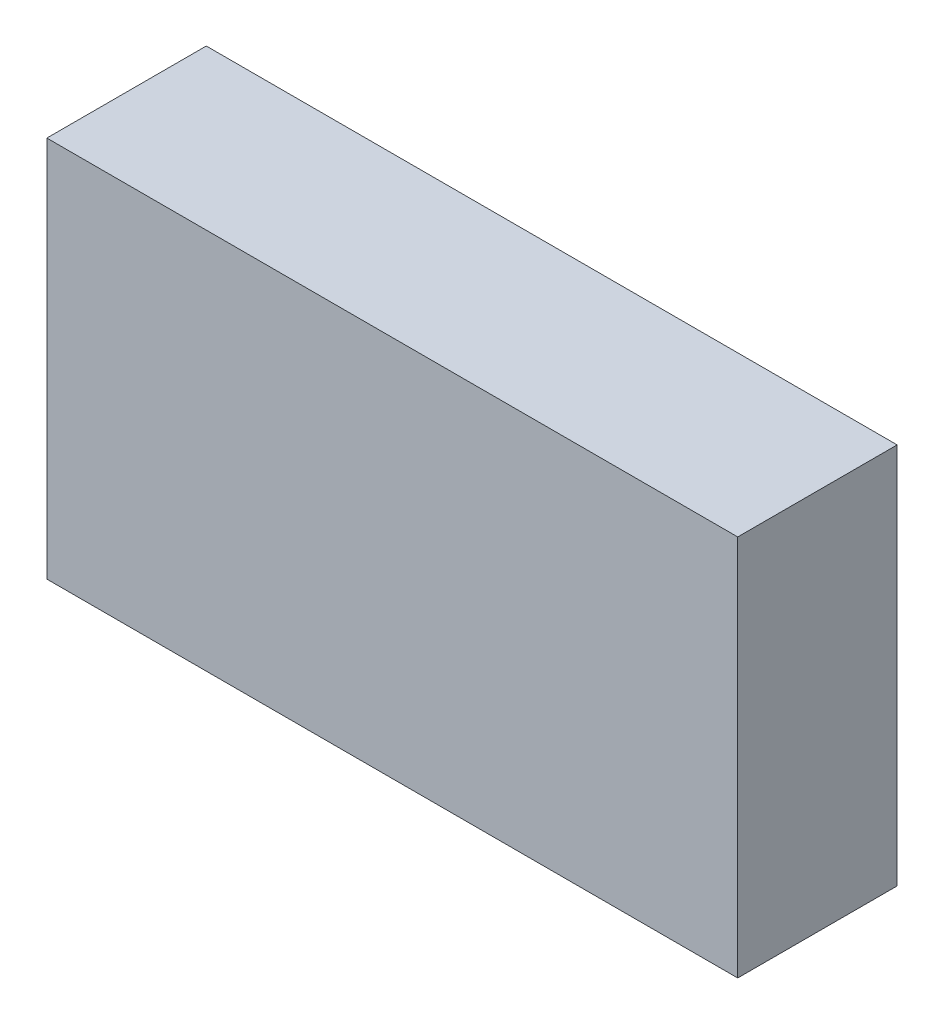
ISO-10303-21;
HEADER;
FILE_DESCRIPTION(('STEP AP214'),'2;1');
FILE_NAME('part.step','',(''),(''),'','','');
FILE_SCHEMA(('AUTOMOTIVE_DESIGN { 1 0 10303 214 1 1 1 1 }'));
ENDSEC;
DATA;
#1=APPLICATION_CONTEXT('core data for automotive mechanical design processes');
#2=APPLICATION_PROTOCOL_DEFINITION('international standard','automotive_design',2000,#1);
#3=PRODUCT_CONTEXT('',#1,'mechanical');
#4=PRODUCT('Part','Part','',(#3));
#5=PRODUCT_RELATED_PRODUCT_CATEGORY('part','',(#4));
#6=PRODUCT_DEFINITION_FORMATION('','',#4);
#7=PRODUCT_DEFINITION_CONTEXT('part definition',#1,'design');
#8=PRODUCT_DEFINITION('design','',#6,#7);
#9=PRODUCT_DEFINITION_SHAPE('','',#8);
#10=(LENGTH_UNIT() NAMED_UNIT(*) SI_UNIT(.MILLI.,.METRE.));
#11=(NAMED_UNIT(*) PLANE_ANGLE_UNIT() SI_UNIT($,.RADIAN.));
#12=(NAMED_UNIT(*) SI_UNIT($,.STERADIAN.) SOLID_ANGLE_UNIT());
#13=UNCERTAINTY_MEASURE_WITH_UNIT(LENGTH_MEASURE(1.E-05),#10,'distance_accuracy_value','');
#14=(GEOMETRIC_REPRESENTATION_CONTEXT(3) GLOBAL_UNCERTAINTY_ASSIGNED_CONTEXT((#13)) GLOBAL_UNIT_ASSIGNED_CONTEXT((#10,
#11,#12)) REPRESENTATION_CONTEXT('',''));
#15=CARTESIAN_POINT('',(0.,0.,0.));
#16=DIRECTION('',(0.,0.,1.));
#17=DIRECTION('',(1.,0.,0.));
#18=AXIS2_PLACEMENT_3D('',#15,#16,#17);
#19=CARTESIAN_POINT('',(0.06,0.,0.54));
#20=DIRECTION('',(0.,0.,1.));
#21=DIRECTION('',(1.,0.,0.));
#22=AXIS2_PLACEMENT_3D('',#19,#20,#21);
#23=PLANE('',#22);
#24=DIRECTION('',(0.,1.,0.));
#25=VECTOR('',#24,1.);
#26=CARTESIAN_POINT('',(2.14,0.,0.54));
#27=LINE('',#26,#25);
#28=CARTESIAN_POINT('',(2.14,1.15,0.54));
#29=VERTEX_POINT('',#28);
#30=CARTESIAN_POINT('',(2.14,0.,0.54));
#31=VERTEX_POINT('',#30);
#32=EDGE_CURVE('E76',#29,#31,#27,.F.);
#33=ORIENTED_EDGE('',*,*,#32,.F.);
#34=DIRECTION('',(1.,0.,0.));
#35=VECTOR('',#34,1.);
#36=CARTESIAN_POINT('',(0.06,1.15,0.54));
#37=LINE('',#36,#35);
#38=CARTESIAN_POINT('',(0.06,1.15,0.54));
#39=VERTEX_POINT('',#38);
#40=EDGE_CURVE('E58',#39,#29,#37,.T.);
#41=ORIENTED_EDGE('',*,*,#40,.F.);
#42=DIRECTION('',(0.,1.,0.));
#43=VECTOR('',#42,1.);
#44=CARTESIAN_POINT('',(0.06,0.,0.54));
#45=LINE('',#44,#43);
#46=CARTESIAN_POINT('',(0.06,0.,0.54));
#47=VERTEX_POINT('',#46);
#48=EDGE_CURVE('E20',#39,#47,#45,.F.);
#49=ORIENTED_EDGE('',*,*,#48,.T.);
#50=DIRECTION('',(1.,0.,0.));
#51=VECTOR('',#50,1.);
#52=CARTESIAN_POINT('',(0.06,0.,0.54));
#53=LINE('',#52,#51);
#54=EDGE_CURVE('E55',#47,#31,#53,.T.);
#55=ORIENTED_EDGE('',*,*,#54,.T.);
#56=EDGE_LOOP('',(#33,#41,#49,#55));
#57=FACE_BOUND('',#56,.T.);
#58=ADVANCED_FACE('F17',(#57),#23,.T.);
#59=CARTESIAN_POINT('',(0.06,0.,0.06));
#60=DIRECTION('',(1.,0.,0.));
#61=DIRECTION('',(0.,0.,-1.));
#62=AXIS2_PLACEMENT_3D('',#59,#60,#61);
#63=PLANE('',#62);
#64=DIRECTION('',(0.,0.,1.));
#65=VECTOR('',#64,1.);
#66=CARTESIAN_POINT('',(0.06,1.15,0.06));
#67=LINE('',#66,#65);
#68=CARTESIAN_POINT('',(0.06,1.15,0.06));
#69=VERTEX_POINT('',#68);
#70=EDGE_CURVE('E78',#69,#39,#67,.T.);
#71=ORIENTED_EDGE('',*,*,#70,.F.);
#72=DIRECTION('',(0.,1.,0.));
#73=VECTOR('',#72,1.);
#74=CARTESIAN_POINT('',(0.06,0.,0.06));
#75=LINE('',#74,#73);
#76=CARTESIAN_POINT('',(0.06,0.,0.06));
#77=VERTEX_POINT('',#76);
#78=EDGE_CURVE('E73',#69,#77,#75,.F.);
#79=ORIENTED_EDGE('',*,*,#78,.T.);
#80=DIRECTION('',(0.,0.,1.));
#81=VECTOR('',#80,1.);
#82=CARTESIAN_POINT('',(0.06,0.,0.06));
#83=LINE('',#82,#81);
#84=EDGE_CURVE('E63',#77,#47,#83,.T.);
#85=ORIENTED_EDGE('',*,*,#84,.T.);
#86=ORIENTED_EDGE('',*,*,#48,.F.);
#87=EDGE_LOOP('',(#71,#79,#85,#86));
#88=FACE_BOUND('',#87,.T.);
#89=ADVANCED_FACE('F72',(#88),#63,.F.);
#90=CARTESIAN_POINT('',(0.06,0.,0.06));
#91=DIRECTION('',(0.,1.,0.));
#92=DIRECTION('',(0.,0.,1.));
#93=AXIS2_PLACEMENT_3D('',#90,#91,#92);
#94=PLANE('',#93);
#95=ORIENTED_EDGE('',*,*,#54,.F.);
#96=ORIENTED_EDGE('',*,*,#84,.F.);
#97=DIRECTION('',(1.,0.,0.));
#98=VECTOR('',#97,1.);
#99=CARTESIAN_POINT('',(0.06,0.,0.06));
#100=LINE('',#99,#98);
#101=CARTESIAN_POINT('',(2.14,0.,0.06));
#102=VERTEX_POINT('',#101);
#103=EDGE_CURVE('E83',#77,#102,#100,.T.);
#104=ORIENTED_EDGE('',*,*,#103,.T.);
#105=DIRECTION('',(0.,0.,-1.));
#106=VECTOR('',#105,1.);
#107=CARTESIAN_POINT('',(2.14,0.,0.06));
#108=LINE('',#107,#106);
#109=EDGE_CURVE('E69',#31,#102,#108,.T.);
#110=ORIENTED_EDGE('',*,*,#109,.F.);
#111=EDGE_LOOP('',(#95,#96,#104,#110));
#112=FACE_BOUND('',#111,.T.);
#113=ADVANCED_FACE('F66',(#112),#94,.F.);
#114=CARTESIAN_POINT('',(2.14,0.,0.06));
#115=DIRECTION('',(1.,0.,0.));
#116=DIRECTION('',(0.,0.,-1.));
#117=AXIS2_PLACEMENT_3D('',#114,#115,#116);
#118=PLANE('',#117);
#119=DIRECTION('',(0.,0.,1.));
#120=VECTOR('',#119,1.);
#121=CARTESIAN_POINT('',(2.14,1.15,0.06));
#122=LINE('',#121,#120);
#123=CARTESIAN_POINT('',(2.14,1.15,0.06));
#124=VERTEX_POINT('',#123);
#125=EDGE_CURVE('E34',#29,#124,#122,.F.);
#126=ORIENTED_EDGE('',*,*,#125,.F.);
#127=ORIENTED_EDGE('',*,*,#32,.T.);
#128=ORIENTED_EDGE('',*,*,#109,.T.);
#129=DIRECTION('',(0.,1.,0.));
#130=VECTOR('',#129,1.);
#131=CARTESIAN_POINT('',(2.14,0.,0.06));
#132=LINE('',#131,#130);
#133=EDGE_CURVE('E26',#102,#124,#132,.T.);
#134=ORIENTED_EDGE('',*,*,#133,.T.);
#135=EDGE_LOOP('',(#126,#127,#128,#134));
#136=FACE_BOUND('',#135,.T.);
#137=ADVANCED_FACE('F88',(#136),#118,.T.);
#138=CARTESIAN_POINT('',(0.06,1.15,0.06));
#139=DIRECTION('',(0.,1.,0.));
#140=DIRECTION('',(0.,0.,1.));
#141=AXIS2_PLACEMENT_3D('',#138,#139,#140);
#142=PLANE('',#141);
#143=ORIENTED_EDGE('',*,*,#40,.T.);
#144=ORIENTED_EDGE('',*,*,#125,.T.);
#145=DIRECTION('',(1.,0.,0.));
#146=VECTOR('',#145,1.);
#147=CARTESIAN_POINT('',(0.06,1.15,0.06));
#148=LINE('',#147,#146);
#149=EDGE_CURVE('E11',#124,#69,#148,.F.);
#150=ORIENTED_EDGE('',*,*,#149,.T.);
#151=ORIENTED_EDGE('',*,*,#70,.T.);
#152=EDGE_LOOP('',(#143,#144,#150,#151));
#153=FACE_BOUND('',#152,.T.);
#154=ADVANCED_FACE('F91',(#153),#142,.T.);
#155=CARTESIAN_POINT('',(0.06,0.,0.06));
#156=DIRECTION('',(0.,0.,1.));
#157=DIRECTION('',(1.,0.,0.));
#158=AXIS2_PLACEMENT_3D('',#155,#156,#157);
#159=PLANE('',#158);
#160=ORIENTED_EDGE('',*,*,#133,.F.);
#161=ORIENTED_EDGE('',*,*,#103,.F.);
#162=ORIENTED_EDGE('',*,*,#78,.F.);
#163=ORIENTED_EDGE('',*,*,#149,.F.);
#164=EDGE_LOOP('',(#160,#161,#162,#163));
#165=FACE_BOUND('',#164,.T.);
#166=ADVANCED_FACE('F90',(#165),#159,.F.);
#167=CLOSED_SHELL('',(#58,#89,#113,#137,#154,#166));
#168=MANIFOLD_SOLID_BREP('B1',#167);
#169=ADVANCED_BREP_SHAPE_REPRESENTATION('',(#18,#168),#14);
#170=SHAPE_DEFINITION_REPRESENTATION(#9,#169);
ENDSEC;
END-ISO-10303-21;
